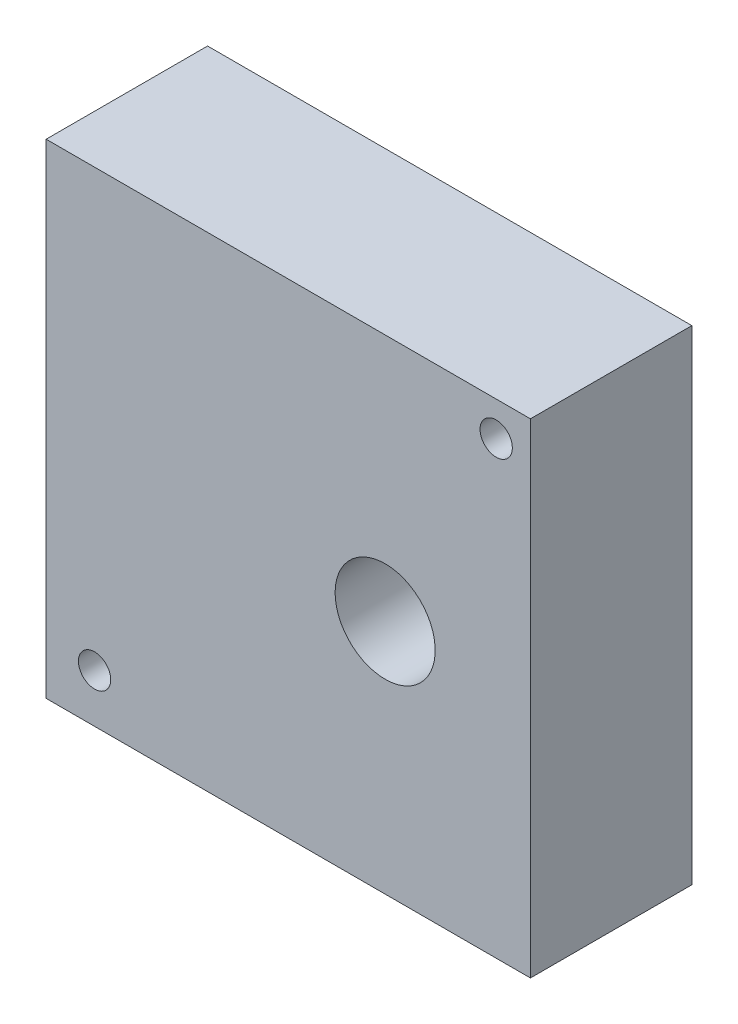
ISO-10303-21;
HEADER;
FILE_DESCRIPTION(('STEP AP214'),'2;1');
FILE_NAME('part.step','',(''),(''),'','','');
FILE_SCHEMA(('AUTOMOTIVE_DESIGN { 1 0 10303 214 1 1 1 1 }'));
ENDSEC;
DATA;
#1=APPLICATION_CONTEXT('core data for automotive mechanical design processes');
#2=APPLICATION_PROTOCOL_DEFINITION('international standard','automotive_design',2000,#1);
#3=PRODUCT_CONTEXT('',#1,'mechanical');
#4=PRODUCT('Part','Part','',(#3));
#5=PRODUCT_RELATED_PRODUCT_CATEGORY('part','',(#4));
#6=PRODUCT_DEFINITION_FORMATION('','',#4);
#7=PRODUCT_DEFINITION_CONTEXT('part definition',#1,'design');
#8=PRODUCT_DEFINITION('design','',#6,#7);
#9=PRODUCT_DEFINITION_SHAPE('','',#8);
#10=(LENGTH_UNIT() NAMED_UNIT(*) SI_UNIT(.MILLI.,.METRE.));
#11=(NAMED_UNIT(*) PLANE_ANGLE_UNIT() SI_UNIT($,.RADIAN.));
#12=(NAMED_UNIT(*) SI_UNIT($,.STERADIAN.) SOLID_ANGLE_UNIT());
#13=UNCERTAINTY_MEASURE_WITH_UNIT(LENGTH_MEASURE(1.E-05),#10,'distance_accuracy_value','');
#14=(GEOMETRIC_REPRESENTATION_CONTEXT(3) GLOBAL_UNCERTAINTY_ASSIGNED_CONTEXT((#13)) GLOBAL_UNIT_ASSIGNED_CONTEXT((#10,
#11,#12)) REPRESENTATION_CONTEXT('',''));
#15=CARTESIAN_POINT('',(0.,0.,0.));
#16=DIRECTION('',(0.,0.,1.));
#17=DIRECTION('',(1.,0.,0.));
#18=AXIS2_PLACEMENT_3D('',#15,#16,#17);
#19=CARTESIAN_POINT('',(15.,15.,10.));
#20=DIRECTION('',(-1.,0.,0.));
#21=DIRECTION('',(0.,-1.,0.));
#22=AXIS2_PLACEMENT_3D('',#19,#20,#21);
#23=PLANE('',#22);
#24=DIRECTION('',(0.,1.,0.));
#25=VECTOR('',#24,1.);
#26=CARTESIAN_POINT('',(15.,15.,0.));
#27=LINE('',#26,#25);
#28=CARTESIAN_POINT('',(15.,-15.,0.));
#29=VERTEX_POINT('',#28);
#30=CARTESIAN_POINT('',(15.,15.,0.));
#31=VERTEX_POINT('',#30);
#32=EDGE_CURVE('E148',#29,#31,#27,.T.);
#33=ORIENTED_EDGE('',*,*,#32,.T.);
#34=DIRECTION('',(0.,0.,-1.));
#35=VECTOR('',#34,1.);
#36=CARTESIAN_POINT('',(15.,15.,10.));
#37=LINE('',#36,#35);
#38=CARTESIAN_POINT('',(15.,15.,10.));
#39=VERTEX_POINT('',#38);
#40=EDGE_CURVE('E12',#39,#31,#37,.T.);
#41=ORIENTED_EDGE('',*,*,#40,.F.);
#42=DIRECTION('',(0.,1.,0.));
#43=VECTOR('',#42,1.);
#44=CARTESIAN_POINT('',(15.,15.,10.));
#45=LINE('',#44,#43);
#46=CARTESIAN_POINT('',(15.,-15.,10.));
#47=VERTEX_POINT('',#46);
#48=EDGE_CURVE('E136',#47,#39,#45,.T.);
#49=ORIENTED_EDGE('',*,*,#48,.F.);
#50=DIRECTION('',(0.,0.,-1.));
#51=VECTOR('',#50,1.);
#52=CARTESIAN_POINT('',(15.,-15.,10.));
#53=LINE('',#52,#51);
#54=EDGE_CURVE('E144',#47,#29,#53,.T.);
#55=ORIENTED_EDGE('',*,*,#54,.T.);
#56=EDGE_LOOP('',(#33,#41,#49,#55));
#57=FACE_BOUND('',#56,.T.);
#58=ADVANCED_FACE('F85',(#57),#23,.F.);
#59=CARTESIAN_POINT('',(-15.,15.,10.));
#60=DIRECTION('',(0.,-1.,0.));
#61=DIRECTION('',(0.,0.,-1.));
#62=AXIS2_PLACEMENT_3D('',#59,#60,#61);
#63=PLANE('',#62);
#64=DIRECTION('',(-1.,0.,0.));
#65=VECTOR('',#64,1.);
#66=CARTESIAN_POINT('',(-15.,15.,0.));
#67=LINE('',#66,#65);
#68=CARTESIAN_POINT('',(-15.,15.,0.));
#69=VERTEX_POINT('',#68);
#70=EDGE_CURVE('E140',#31,#69,#67,.T.);
#71=ORIENTED_EDGE('',*,*,#70,.T.);
#72=DIRECTION('',(0.,0.,-1.));
#73=VECTOR('',#72,1.);
#74=CARTESIAN_POINT('',(-15.,15.,10.));
#75=LINE('',#74,#73);
#76=CARTESIAN_POINT('',(-15.,15.,10.));
#77=VERTEX_POINT('',#76);
#78=EDGE_CURVE('E93',#77,#69,#75,.T.);
#79=ORIENTED_EDGE('',*,*,#78,.F.);
#80=DIRECTION('',(-1.,0.,0.));
#81=VECTOR('',#80,1.);
#82=CARTESIAN_POINT('',(-15.,15.,10.));
#83=LINE('',#82,#81);
#84=EDGE_CURVE('E131',#39,#77,#83,.T.);
#85=ORIENTED_EDGE('',*,*,#84,.F.);
#86=ORIENTED_EDGE('',*,*,#40,.T.);
#87=EDGE_LOOP('',(#71,#79,#85,#86));
#88=FACE_BOUND('',#87,.T.);
#89=ADVANCED_FACE('F139',(#88),#63,.F.);
#90=CARTESIAN_POINT('',(-15.,15.,10.));
#91=DIRECTION('',(1.,0.,0.));
#92=DIRECTION('',(0.,1.,0.));
#93=AXIS2_PLACEMENT_3D('',#90,#91,#92);
#94=PLANE('',#93);
#95=DIRECTION('',(0.,-1.,0.));
#96=VECTOR('',#95,1.);
#97=CARTESIAN_POINT('',(-15.,15.,0.));
#98=LINE('',#97,#96);
#99=CARTESIAN_POINT('',(-15.,-15.,0.));
#100=VERTEX_POINT('',#99);
#101=EDGE_CURVE('E118',#69,#100,#98,.T.);
#102=ORIENTED_EDGE('',*,*,#101,.T.);
#103=DIRECTION('',(0.,0.,-1.));
#104=VECTOR('',#103,1.);
#105=CARTESIAN_POINT('',(-15.,-15.,10.));
#106=LINE('',#105,#104);
#107=CARTESIAN_POINT('',(-15.,-15.,10.));
#108=VERTEX_POINT('',#107);
#109=EDGE_CURVE('E141',#108,#100,#106,.T.);
#110=ORIENTED_EDGE('',*,*,#109,.F.);
#111=DIRECTION('',(0.,-1.,0.));
#112=VECTOR('',#111,1.);
#113=CARTESIAN_POINT('',(-15.,15.,10.));
#114=LINE('',#113,#112);
#115=EDGE_CURVE('E134',#77,#108,#114,.T.);
#116=ORIENTED_EDGE('',*,*,#115,.F.);
#117=ORIENTED_EDGE('',*,*,#78,.T.);
#118=EDGE_LOOP('',(#102,#110,#116,#117));
#119=FACE_BOUND('',#118,.T.);
#120=ADVANCED_FACE('F142',(#119),#94,.F.);
#121=CARTESIAN_POINT('',(-15.,-15.,10.));
#122=DIRECTION('',(0.,1.,0.));
#123=DIRECTION('',(0.,0.,1.));
#124=AXIS2_PLACEMENT_3D('',#121,#122,#123);
#125=PLANE('',#124);
#126=DIRECTION('',(1.,0.,0.));
#127=VECTOR('',#126,1.);
#128=CARTESIAN_POINT('',(-15.,-15.,0.));
#129=LINE('',#128,#127);
#130=EDGE_CURVE('E124',#100,#29,#129,.T.);
#131=ORIENTED_EDGE('',*,*,#130,.T.);
#132=ORIENTED_EDGE('',*,*,#54,.F.);
#133=DIRECTION('',(1.,0.,0.));
#134=VECTOR('',#133,1.);
#135=CARTESIAN_POINT('',(-15.,-15.,10.));
#136=LINE('',#135,#134);
#137=EDGE_CURVE('E101',#108,#47,#136,.T.);
#138=ORIENTED_EDGE('',*,*,#137,.F.);
#139=ORIENTED_EDGE('',*,*,#109,.T.);
#140=EDGE_LOOP('',(#131,#132,#138,#139));
#141=FACE_BOUND('',#140,.T.);
#142=ADVANCED_FACE('F156',(#141),#125,.F.);
#143=CARTESIAN_POINT('',(0.,0.,10.));
#144=DIRECTION('',(0.,0.,1.));
#145=DIRECTION('',(1.,0.,0.));
#146=AXIS2_PLACEMENT_3D('',#143,#144,#145);
#147=PLANE('',#146);
#148=CARTESIAN_POINT('',(-12.,-12.,10.));
#149=DIRECTION('',(0.,0.,1.));
#150=DIRECTION('',(1.,0.,0.));
#151=AXIS2_PLACEMENT_3D('',#148,#149,#150);
#152=CIRCLE('',#151,1.);
#153=CARTESIAN_POINT('',(-11.,-12.,10.));
#154=VERTEX_POINT('',#153);
#155=EDGE_CURVE('E165',#154,#154,#152,.T.);
#156=ORIENTED_EDGE('',*,*,#155,.F.);
#157=EDGE_LOOP('',(#156));
#158=FACE_BOUND('',#157,.T.);
#159=CARTESIAN_POINT('',(12.8786796564404,12.8786796564404,10.));
#160=DIRECTION('',(0.,0.,1.));
#161=DIRECTION('',(1.,0.,0.));
#162=AXIS2_PLACEMENT_3D('',#159,#160,#161);
#163=CIRCLE('',#162,1.);
#164=CARTESIAN_POINT('',(13.8786796564404,12.8786796564404,10.));
#165=VERTEX_POINT('',#164);
#166=EDGE_CURVE('E170',#165,#165,#163,.T.);
#167=ORIENTED_EDGE('',*,*,#166,.F.);
#168=EDGE_LOOP('',(#167));
#169=FACE_BOUND('',#168,.T.);
#170=CARTESIAN_POINT('',(6.,-0.37289947363206,10.));
#171=DIRECTION('',(0.,0.,-1.));
#172=DIRECTION('',(-1.,0.,0.));
#173=AXIS2_PLACEMENT_3D('',#170,#171,#172);
#174=CIRCLE('',#173,3.1);
#175=CARTESIAN_POINT('',(2.9,-0.37289947363206,10.));
#176=VERTEX_POINT('',#175);
#177=EDGE_CURVE('E151',#176,#176,#174,.T.);
#178=ORIENTED_EDGE('',*,*,#177,.T.);
#179=EDGE_LOOP('',(#178));
#180=FACE_BOUND('',#179,.T.);
#181=ORIENTED_EDGE('',*,*,#48,.T.);
#182=ORIENTED_EDGE('',*,*,#84,.T.);
#183=ORIENTED_EDGE('',*,*,#115,.T.);
#184=ORIENTED_EDGE('',*,*,#137,.T.);
#185=EDGE_LOOP('',(#181,#182,#183,#184));
#186=FACE_BOUND('',#185,.T.);
#187=ADVANCED_FACE('F132',(#158,#169,#180,#186),#147,.T.);
#188=CARTESIAN_POINT('',(0.,0.,0.));
#189=DIRECTION('',(0.,0.,1.));
#190=DIRECTION('',(1.,0.,0.));
#191=AXIS2_PLACEMENT_3D('',#188,#189,#190);
#192=PLANE('',#191);
#193=CARTESIAN_POINT('',(-12.,-12.,0.));
#194=DIRECTION('',(0.,0.,1.));
#195=DIRECTION('',(1.,0.,0.));
#196=AXIS2_PLACEMENT_3D('',#193,#194,#195);
#197=CIRCLE('',#196,1.);
#198=CARTESIAN_POINT('',(-11.,-12.,0.));
#199=VERTEX_POINT('',#198);
#200=EDGE_CURVE('E173',#199,#199,#197,.F.);
#201=ORIENTED_EDGE('',*,*,#200,.F.);
#202=EDGE_LOOP('',(#201));
#203=FACE_BOUND('',#202,.T.);
#204=CARTESIAN_POINT('',(12.8786796564404,12.8786796564404,0.));
#205=DIRECTION('',(0.,0.,1.));
#206=DIRECTION('',(1.,0.,0.));
#207=AXIS2_PLACEMENT_3D('',#204,#205,#206);
#208=CIRCLE('',#207,1.);
#209=CARTESIAN_POINT('',(13.8786796564404,12.8786796564404,0.));
#210=VERTEX_POINT('',#209);
#211=EDGE_CURVE('E174',#210,#210,#208,.F.);
#212=ORIENTED_EDGE('',*,*,#211,.F.);
#213=EDGE_LOOP('',(#212));
#214=FACE_BOUND('',#213,.T.);
#215=CARTESIAN_POINT('',(6.,-0.37289947363206,0.));
#216=DIRECTION('',(0.,0.,-1.));
#217=DIRECTION('',(-1.,0.,0.));
#218=AXIS2_PLACEMENT_3D('',#215,#216,#217);
#219=CIRCLE('',#218,3.1);
#220=CARTESIAN_POINT('',(2.9,-0.37289947363206,0.));
#221=VERTEX_POINT('',#220);
#222=EDGE_CURVE('E162',#221,#221,#219,.T.);
#223=ORIENTED_EDGE('',*,*,#222,.F.);
#224=EDGE_LOOP('',(#223));
#225=FACE_BOUND('',#224,.T.);
#226=ORIENTED_EDGE('',*,*,#32,.F.);
#227=ORIENTED_EDGE('',*,*,#130,.F.);
#228=ORIENTED_EDGE('',*,*,#101,.F.);
#229=ORIENTED_EDGE('',*,*,#70,.F.);
#230=EDGE_LOOP('',(#226,#227,#228,#229));
#231=FACE_BOUND('',#230,.T.);
#232=ADVANCED_FACE('F159',(#203,#214,#225,#231),#192,.F.);
#233=CARTESIAN_POINT('',(6.,-0.37289947363206,10.));
#234=DIRECTION('',(0.,0.,-1.));
#235=DIRECTION('',(-1.,0.,0.));
#236=AXIS2_PLACEMENT_3D('',#233,#234,#235);
#237=CYLINDRICAL_SURFACE('',#236,3.1);
#238=ORIENTED_EDGE('',*,*,#177,.F.);
#239=EDGE_LOOP('',(#238));
#240=FACE_BOUND('',#239,.T.);
#241=ORIENTED_EDGE('',*,*,#222,.T.);
#242=EDGE_LOOP('',(#241));
#243=FACE_BOUND('',#242,.T.);
#244=ADVANCED_FACE('F184',(#240,#243),#237,.F.);
#245=CARTESIAN_POINT('',(12.8786796564404,12.8786796564404,-2.82842712474619));
#246=DIRECTION('',(0.,0.,1.));
#247=DIRECTION('',(1.,0.,0.));
#248=AXIS2_PLACEMENT_3D('',#245,#246,#247);
#249=CYLINDRICAL_SURFACE('',#248,1.);
#250=ORIENTED_EDGE('',*,*,#166,.T.);
#251=EDGE_LOOP('',(#250));
#252=FACE_BOUND('',#251,.T.);
#253=ORIENTED_EDGE('',*,*,#211,.T.);
#254=EDGE_LOOP('',(#253));
#255=FACE_BOUND('',#254,.T.);
#256=ADVANCED_FACE('F191',(#252,#255),#249,.F.);
#257=CARTESIAN_POINT('',(-12.,-12.,-2.82842712474619));
#258=DIRECTION('',(0.,0.,1.));
#259=DIRECTION('',(1.,0.,0.));
#260=AXIS2_PLACEMENT_3D('',#257,#258,#259);
#261=CYLINDRICAL_SURFACE('',#260,1.);
#262=ORIENTED_EDGE('',*,*,#155,.T.);
#263=EDGE_LOOP('',(#262));
#264=FACE_BOUND('',#263,.T.);
#265=ORIENTED_EDGE('',*,*,#200,.T.);
#266=EDGE_LOOP('',(#265));
#267=FACE_BOUND('',#266,.T.);
#268=ADVANCED_FACE('F180',(#264,#267),#261,.F.);
#269=CLOSED_SHELL('',(#58,#89,#120,#142,#187,#232,#244,#256,#268));
#270=MANIFOLD_SOLID_BREP('B2',#269);
#271=ADVANCED_BREP_SHAPE_REPRESENTATION('',(#18,#270),#14);
#272=SHAPE_DEFINITION_REPRESENTATION(#9,#271);
ENDSEC;
END-ISO-10303-21;
